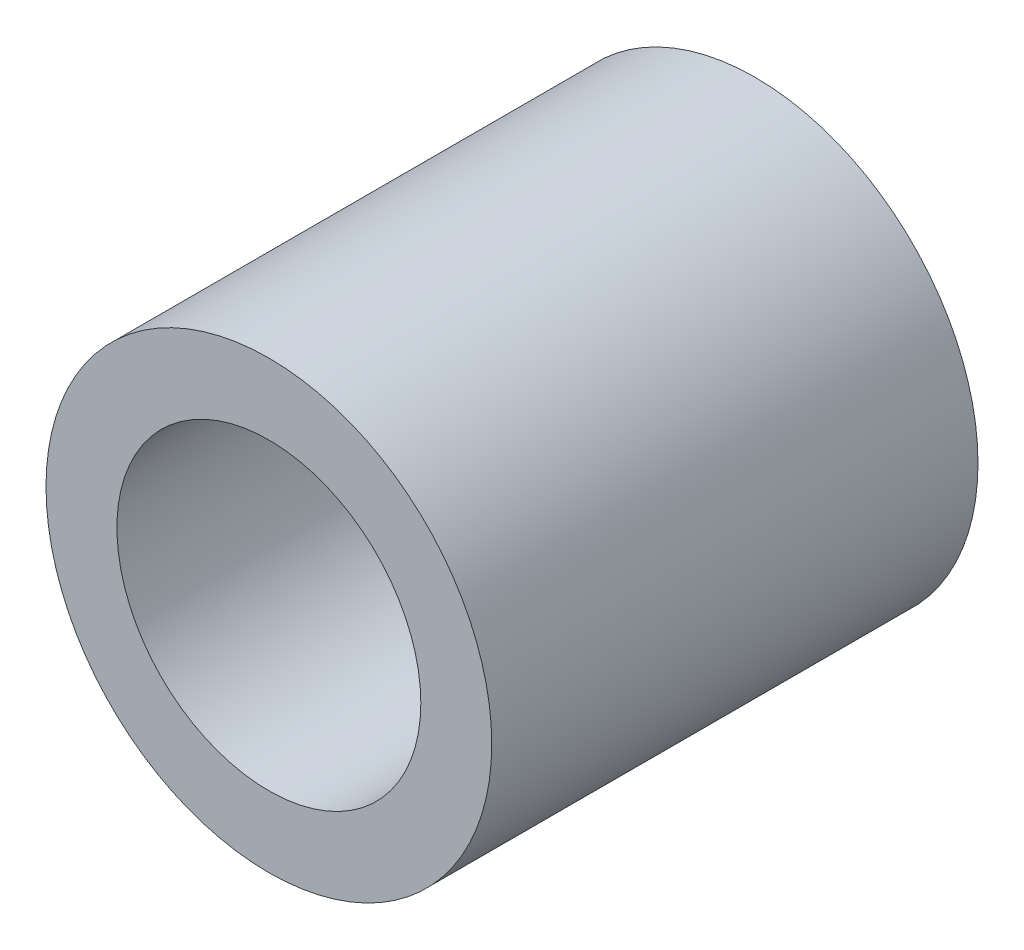
ISO-10303-21;
HEADER;
FILE_DESCRIPTION(('STEP AP214'),'2;1');
FILE_NAME('part.step','',(''),(''),'','','');
FILE_SCHEMA(('AUTOMOTIVE_DESIGN { 1 0 10303 214 1 1 1 1 }'));
ENDSEC;
DATA;
#1=APPLICATION_CONTEXT('core data for automotive mechanical design processes');
#2=APPLICATION_PROTOCOL_DEFINITION('international standard','automotive_design',2000,#1);
#3=PRODUCT_CONTEXT('',#1,'mechanical');
#4=PRODUCT('Part','Part','',(#3));
#5=PRODUCT_RELATED_PRODUCT_CATEGORY('part','',(#4));
#6=PRODUCT_DEFINITION_FORMATION('','',#4);
#7=PRODUCT_DEFINITION_CONTEXT('part definition',#1,'design');
#8=PRODUCT_DEFINITION('design','',#6,#7);
#9=PRODUCT_DEFINITION_SHAPE('','',#8);
#10=(LENGTH_UNIT() NAMED_UNIT(*) SI_UNIT(.MILLI.,.METRE.));
#11=(NAMED_UNIT(*) PLANE_ANGLE_UNIT() SI_UNIT($,.RADIAN.));
#12=(NAMED_UNIT(*) SI_UNIT($,.STERADIAN.) SOLID_ANGLE_UNIT());
#13=UNCERTAINTY_MEASURE_WITH_UNIT(LENGTH_MEASURE(1.E-05),#10,'distance_accuracy_value','');
#14=(GEOMETRIC_REPRESENTATION_CONTEXT(3) GLOBAL_UNCERTAINTY_ASSIGNED_CONTEXT((#13)) GLOBAL_UNIT_ASSIGNED_CONTEXT((#10,
#11,#12)) REPRESENTATION_CONTEXT('',''));
#15=CARTESIAN_POINT('',(0.,0.,0.));
#16=DIRECTION('',(0.,0.,1.));
#17=DIRECTION('',(1.,0.,0.));
#18=AXIS2_PLACEMENT_3D('',#15,#16,#17);
#19=CARTESIAN_POINT('',(0.,0.,24.));
#20=DIRECTION('',(0.,0.,1.));
#21=DIRECTION('',(1.,0.,0.));
#22=AXIS2_PLACEMENT_3D('',#19,#20,#21);
#23=PLANE('',#22);
#24=CARTESIAN_POINT('',(0.,0.,24.));
#25=DIRECTION('',(0.,0.,1.));
#26=DIRECTION('',(1.,0.,0.));
#27=AXIS2_PLACEMENT_3D('',#24,#25,#26);
#28=CIRCLE('',#27,11.);
#29=CARTESIAN_POINT('',(11.,0.,24.));
#30=VERTEX_POINT('',#29);
#31=EDGE_CURVE('E10',#30,#30,#28,.T.);
#32=ORIENTED_EDGE('',*,*,#31,.T.);
#33=EDGE_LOOP('',(#32));
#34=FACE_BOUND('',#33,.T.);
#35=CARTESIAN_POINT('',(0.,0.,24.));
#36=DIRECTION('',(0.,0.,1.));
#37=DIRECTION('',(1.,0.,0.));
#38=AXIS2_PLACEMENT_3D('',#35,#36,#37);
#39=CIRCLE('',#38,7.5);
#40=CARTESIAN_POINT('',(7.5,0.,24.));
#41=VERTEX_POINT('',#40);
#42=EDGE_CURVE('E50',#41,#41,#39,.T.);
#43=ORIENTED_EDGE('',*,*,#42,.F.);
#44=EDGE_LOOP('',(#43));
#45=FACE_BOUND('',#44,.T.);
#46=ADVANCED_FACE('F37',(#34,#45),#23,.T.);
#47=CARTESIAN_POINT('',(0.,0.,0.));
#48=DIRECTION('',(0.,0.,1.));
#49=DIRECTION('',(1.,0.,0.));
#50=AXIS2_PLACEMENT_3D('',#47,#48,#49);
#51=PLANE('',#50);
#52=CARTESIAN_POINT('',(0.,0.,0.));
#53=DIRECTION('',(0.,0.,1.));
#54=DIRECTION('',(1.,0.,0.));
#55=AXIS2_PLACEMENT_3D('',#52,#53,#54);
#56=CIRCLE('',#55,11.);
#57=CARTESIAN_POINT('',(11.,0.,0.));
#58=VERTEX_POINT('',#57);
#59=EDGE_CURVE('E41',#58,#58,#56,.T.);
#60=ORIENTED_EDGE('',*,*,#59,.F.);
#61=EDGE_LOOP('',(#60));
#62=FACE_BOUND('',#61,.T.);
#63=CARTESIAN_POINT('',(0.,0.,0.));
#64=DIRECTION('',(0.,0.,1.));
#65=DIRECTION('',(1.,0.,0.));
#66=AXIS2_PLACEMENT_3D('',#63,#64,#65);
#67=CIRCLE('',#66,7.5);
#68=CARTESIAN_POINT('',(7.5,0.,0.));
#69=VERTEX_POINT('',#68);
#70=EDGE_CURVE('E52',#69,#69,#67,.T.);
#71=ORIENTED_EDGE('',*,*,#70,.T.);
#72=EDGE_LOOP('',(#71));
#73=FACE_BOUND('',#72,.T.);
#74=ADVANCED_FACE('F64',(#62,#73),#51,.F.);
#75=CARTESIAN_POINT('',(0.,0.,24.));
#76=DIRECTION('',(0.,0.,-1.));
#77=DIRECTION('',(-1.,0.,0.));
#78=AXIS2_PLACEMENT_3D('',#75,#76,#77);
#79=CYLINDRICAL_SURFACE('',#78,11.);
#80=ORIENTED_EDGE('',*,*,#31,.F.);
#81=EDGE_LOOP('',(#80));
#82=FACE_BOUND('',#81,.T.);
#83=ORIENTED_EDGE('',*,*,#59,.T.);
#84=EDGE_LOOP('',(#83));
#85=FACE_BOUND('',#84,.T.);
#86=ADVANCED_FACE('F39',(#82,#85),#79,.T.);
#87=CARTESIAN_POINT('',(0.,0.,24.));
#88=DIRECTION('',(0.,0.,-1.));
#89=DIRECTION('',(-1.,0.,0.));
#90=AXIS2_PLACEMENT_3D('',#87,#88,#89);
#91=CYLINDRICAL_SURFACE('',#90,7.5);
#92=ORIENTED_EDGE('',*,*,#42,.T.);
#93=EDGE_LOOP('',(#92));
#94=FACE_BOUND('',#93,.T.);
#95=ORIENTED_EDGE('',*,*,#70,.F.);
#96=EDGE_LOOP('',(#95));
#97=FACE_BOUND('',#96,.T.);
#98=ADVANCED_FACE('F60',(#94,#97),#91,.F.);
#99=CLOSED_SHELL('',(#46,#74,#86,#98));
#100=MANIFOLD_SOLID_BREP('B2',#99);
#101=ADVANCED_BREP_SHAPE_REPRESENTATION('',(#18,#100),#14);
#102=SHAPE_DEFINITION_REPRESENTATION(#9,#101);
ENDSEC;
END-ISO-10303-21;
